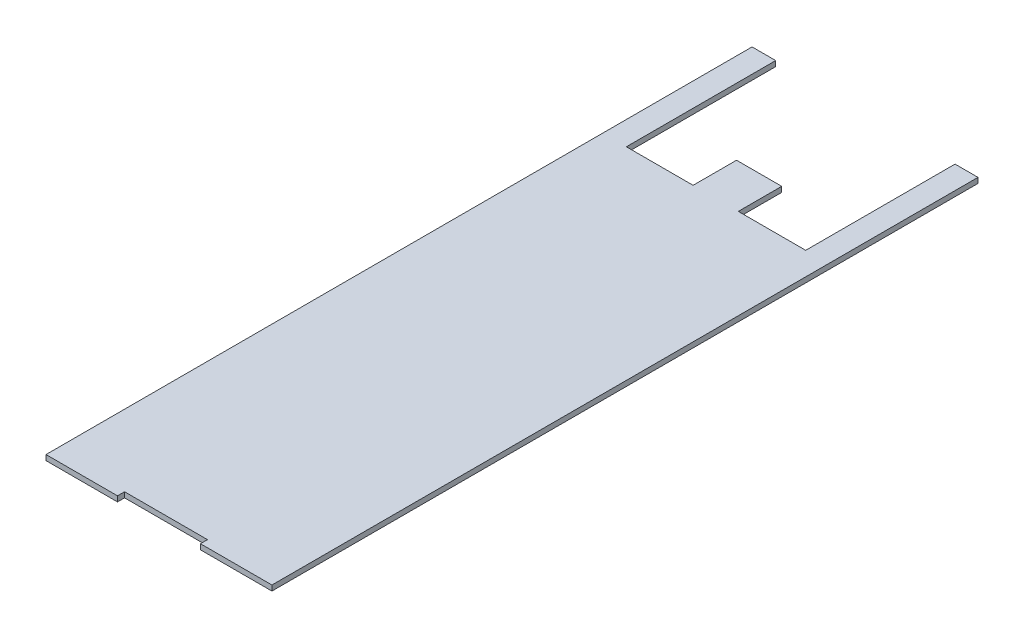
ISO-10303-21;
HEADER;
FILE_DESCRIPTION(('STEP AP214'),'2;1');
FILE_NAME('part.step','',(''),(''),'','','');
FILE_SCHEMA(('AUTOMOTIVE_DESIGN { 1 0 10303 214 1 1 1 1 }'));
ENDSEC;
DATA;
#1=APPLICATION_CONTEXT('core data for automotive mechanical design processes');
#2=APPLICATION_PROTOCOL_DEFINITION('international standard','automotive_design',2000,#1);
#3=PRODUCT_CONTEXT('',#1,'mechanical');
#4=PRODUCT('Part','Part','',(#3));
#5=PRODUCT_RELATED_PRODUCT_CATEGORY('part','',(#4));
#6=PRODUCT_DEFINITION_FORMATION('','',#4);
#7=PRODUCT_DEFINITION_CONTEXT('part definition',#1,'design');
#8=PRODUCT_DEFINITION('design','',#6,#7);
#9=PRODUCT_DEFINITION_SHAPE('','',#8);
#10=(LENGTH_UNIT() NAMED_UNIT(*) SI_UNIT(.MILLI.,.METRE.));
#11=(NAMED_UNIT(*) PLANE_ANGLE_UNIT() SI_UNIT($,.RADIAN.));
#12=(NAMED_UNIT(*) SI_UNIT($,.STERADIAN.) SOLID_ANGLE_UNIT());
#13=UNCERTAINTY_MEASURE_WITH_UNIT(LENGTH_MEASURE(1.E-05),#10,'distance_accuracy_value','');
#14=(GEOMETRIC_REPRESENTATION_CONTEXT(3) GLOBAL_UNCERTAINTY_ASSIGNED_CONTEXT((#13)) GLOBAL_UNIT_ASSIGNED_CONTEXT((#10,
#11,#12)) REPRESENTATION_CONTEXT('',''));
#15=CARTESIAN_POINT('',(0.,0.,0.));
#16=DIRECTION('',(0.,0.,1.));
#17=DIRECTION('',(1.,0.,0.));
#18=AXIS2_PLACEMENT_3D('',#15,#16,#17);
#19=CARTESIAN_POINT('',(-175.21084361372,-551.298939869281,789.620141884685));
#20=DIRECTION('',(0.,0.,-1.));
#21=DIRECTION('',(-1.,0.,0.));
#22=AXIS2_PLACEMENT_3D('',#19,#20,#21);
#23=PLANE('',#22);
#24=DIRECTION('',(-1.,0.,0.));
#25=VECTOR('',#24,1.);
#26=CARTESIAN_POINT('',(-175.21084361372,-548.298939869281,789.620141884685));
#27=LINE('',#26,#25);
#28=CARTESIAN_POINT('',(-47.2108436137029,-548.298939869281,789.620141884685));
#29=VERTEX_POINT('',#28);
#30=CARTESIAN_POINT('',(-87.7108436137114,-548.298939869281,789.620141884685));
#31=VERTEX_POINT('',#30);
#32=EDGE_CURVE('E195',#29,#31,#27,.T.);
#33=ORIENTED_EDGE('',*,*,#32,.T.);
#34=DIRECTION('',(0.,-1.,0.));
#35=VECTOR('',#34,1.);
#36=CARTESIAN_POINT('',(-87.7108436137114,-551.298939869281,789.620141884685));
#37=LINE('',#36,#35);
#38=CARTESIAN_POINT('',(-87.7108436137114,-551.298939869281,789.620141884685));
#39=VERTEX_POINT('',#38);
#40=EDGE_CURVE('E176',#31,#39,#37,.T.);
#41=ORIENTED_EDGE('',*,*,#40,.T.);
#42=DIRECTION('',(-1.,0.,0.));
#43=VECTOR('',#42,1.);
#44=CARTESIAN_POINT('',(-175.21084361372,-551.298939869281,789.620141884685));
#45=LINE('',#44,#43);
#46=CARTESIAN_POINT('',(-47.2108436137029,-551.298939869281,789.620141884685));
#47=VERTEX_POINT('',#46);
#48=EDGE_CURVE('E167',#47,#39,#45,.T.);
#49=ORIENTED_EDGE('',*,*,#48,.F.);
#50=DIRECTION('',(0.,1.,0.));
#51=VECTOR('',#50,1.);
#52=CARTESIAN_POINT('',(-47.2108436137029,-551.298939869281,789.620141884685));
#53=LINE('',#52,#51);
#54=EDGE_CURVE('E161',#47,#29,#53,.T.);
#55=ORIENTED_EDGE('',*,*,#54,.T.);
#56=EDGE_LOOP('',(#33,#41,#49,#55));
#57=FACE_BOUND('',#56,.T.);
#58=ADVANCED_FACE('F33',(#57),#23,.F.);
#59=CARTESIAN_POINT('',(-175.21084361372,-551.298939869281,789.620141884685));
#60=DIRECTION('',(1.,0.,0.));
#61=DIRECTION('',(0.,1.,0.));
#62=AXIS2_PLACEMENT_3D('',#59,#60,#61);
#63=PLANE('',#62);
#64=DIRECTION('',(0.,0.,-1.));
#65=VECTOR('',#64,1.);
#66=CARTESIAN_POINT('',(-175.21084361372,-548.298939869281,789.620141884685));
#67=LINE('',#66,#65);
#68=CARTESIAN_POINT('',(-175.21084361372,-548.298939869281,789.620141884685));
#69=VERTEX_POINT('',#68);
#70=CARTESIAN_POINT('',(-175.21084361372,-548.298939869281,389.620141884643));
#71=VERTEX_POINT('',#70);
#72=EDGE_CURVE('E172',#69,#71,#67,.T.);
#73=ORIENTED_EDGE('',*,*,#72,.T.);
#74=DIRECTION('',(0.,1.,0.));
#75=VECTOR('',#74,1.);
#76=CARTESIAN_POINT('',(-175.21084361372,-551.298939869281,389.620141884643));
#77=LINE('',#76,#75);
#78=CARTESIAN_POINT('',(-175.21084361372,-551.298939869281,389.620141884643));
#79=VERTEX_POINT('',#78);
#80=EDGE_CURVE('E41',#79,#71,#77,.T.);
#81=ORIENTED_EDGE('',*,*,#80,.F.);
#82=DIRECTION('',(0.,0.,-1.));
#83=VECTOR('',#82,1.);
#84=CARTESIAN_POINT('',(-175.21084361372,-551.298939869281,789.620141884685));
#85=LINE('',#84,#83);
#86=CARTESIAN_POINT('',(-175.21084361372,-551.298939869281,789.620141884685));
#87=VERTEX_POINT('',#86);
#88=EDGE_CURVE('E198',#87,#79,#85,.T.);
#89=ORIENTED_EDGE('',*,*,#88,.F.);
#90=DIRECTION('',(0.,1.,0.));
#91=VECTOR('',#90,1.);
#92=CARTESIAN_POINT('',(-175.21084361372,-551.298939869281,789.620141884685));
#93=LINE('',#92,#91);
#94=EDGE_CURVE('E171',#87,#69,#93,.T.);
#95=ORIENTED_EDGE('',*,*,#94,.T.);
#96=EDGE_LOOP('',(#73,#81,#89,#95));
#97=FACE_BOUND('',#96,.T.);
#98=ADVANCED_FACE('F35',(#97),#63,.F.);
#99=CARTESIAN_POINT('',(-175.21084361372,-551.298939869281,389.620141884643));
#100=DIRECTION('',(0.,0.,1.));
#101=DIRECTION('',(1.,0.,0.));
#102=AXIS2_PLACEMENT_3D('',#99,#100,#101);
#103=PLANE('',#102);
#104=DIRECTION('',(1.,0.,0.));
#105=VECTOR('',#104,1.);
#106=CARTESIAN_POINT('',(-175.21084361372,-548.298939869281,389.620141884643));
#107=LINE('',#106,#105);
#108=CARTESIAN_POINT('',(-161.8182411177,-548.298939869281,389.620141884643));
#109=VERTEX_POINT('',#108);
#110=EDGE_CURVE('E175',#71,#109,#107,.T.);
#111=ORIENTED_EDGE('',*,*,#110,.T.);
#112=DIRECTION('',(0.,1.,0.));
#113=VECTOR('',#112,1.);
#114=CARTESIAN_POINT('',(-161.8182411177,-551.298939869281,389.620141884643));
#115=LINE('',#114,#113);
#116=CARTESIAN_POINT('',(-161.8182411177,-551.298939869281,389.620141884643));
#117=VERTEX_POINT('',#116);
#118=EDGE_CURVE('E220',#117,#109,#115,.T.);
#119=ORIENTED_EDGE('',*,*,#118,.F.);
#120=DIRECTION('',(1.,0.,0.));
#121=VECTOR('',#120,1.);
#122=CARTESIAN_POINT('',(-175.21084361372,-551.298939869281,389.620141884643));
#123=LINE('',#122,#121);
#124=EDGE_CURVE('E112',#79,#117,#123,.T.);
#125=ORIENTED_EDGE('',*,*,#124,.F.);
#126=ORIENTED_EDGE('',*,*,#80,.T.);
#127=EDGE_LOOP('',(#111,#119,#125,#126));
#128=FACE_BOUND('',#127,.T.);
#129=ADVANCED_FACE('F223',(#128),#103,.F.);
#130=CARTESIAN_POINT('',(-161.8182411177,-551.298939869281,474.220141884642));
#131=DIRECTION('',(-1.,0.,0.));
#132=DIRECTION('',(0.,-1.,0.));
#133=AXIS2_PLACEMENT_3D('',#130,#131,#132);
#134=PLANE('',#133);
#135=DIRECTION('',(0.,0.,1.));
#136=VECTOR('',#135,1.);
#137=CARTESIAN_POINT('',(-161.8182411177,-548.298939869281,474.220141884642));
#138=LINE('',#137,#136);
#139=CARTESIAN_POINT('',(-161.8182411177,-548.298939869281,474.220141884642));
#140=VERTEX_POINT('',#139);
#141=EDGE_CURVE('E178',#109,#140,#138,.T.);
#142=ORIENTED_EDGE('',*,*,#141,.T.);
#143=DIRECTION('',(0.,1.,0.));
#144=VECTOR('',#143,1.);
#145=CARTESIAN_POINT('',(-161.8182411177,-551.298939869281,474.220141884642));
#146=LINE('',#145,#144);
#147=CARTESIAN_POINT('',(-161.8182411177,-551.298939869281,474.220141884642));
#148=VERTEX_POINT('',#147);
#149=EDGE_CURVE('E217',#148,#140,#146,.T.);
#150=ORIENTED_EDGE('',*,*,#149,.F.);
#151=DIRECTION('',(0.,0.,1.));
#152=VECTOR('',#151,1.);
#153=CARTESIAN_POINT('',(-161.8182411177,-551.298939869281,474.220141884642));
#154=LINE('',#153,#152);
#155=EDGE_CURVE('E246',#117,#148,#154,.T.);
#156=ORIENTED_EDGE('',*,*,#155,.F.);
#157=ORIENTED_EDGE('',*,*,#118,.T.);
#158=EDGE_LOOP('',(#142,#150,#156,#157));
#159=FACE_BOUND('',#158,.T.);
#160=ADVANCED_FACE('F237',(#159),#134,.F.);
#161=CARTESIAN_POINT('',(-161.8182411177,-551.298939869281,474.220141884642));
#162=DIRECTION('',(0.,0.,1.));
#163=DIRECTION('',(1.,0.,0.));
#164=AXIS2_PLACEMENT_3D('',#161,#162,#163);
#165=PLANE('',#164);
#166=DIRECTION('',(1.,0.,0.));
#167=VECTOR('',#166,1.);
#168=CARTESIAN_POINT('',(-161.8182411177,-548.298939869281,474.220141884642));
#169=LINE('',#168,#167);
#170=CARTESIAN_POINT('',(-124.010843613703,-548.298939869281,474.220141884642));
#171=VERTEX_POINT('',#170);
#172=EDGE_CURVE('E180',#140,#171,#169,.T.);
#173=ORIENTED_EDGE('',*,*,#172,.T.);
#174=DIRECTION('',(0.,1.,0.));
#175=VECTOR('',#174,1.);
#176=CARTESIAN_POINT('',(-124.010843613703,-551.298939869281,474.220141884642));
#177=LINE('',#176,#175);
#178=CARTESIAN_POINT('',(-124.010843613703,-551.298939869281,474.220141884642));
#179=VERTEX_POINT('',#178);
#180=EDGE_CURVE('E214',#179,#171,#177,.T.);
#181=ORIENTED_EDGE('',*,*,#180,.F.);
#182=DIRECTION('',(1.,0.,0.));
#183=VECTOR('',#182,1.);
#184=CARTESIAN_POINT('',(-161.8182411177,-551.298939869281,474.220141884642));
#185=LINE('',#184,#183);
#186=EDGE_CURVE('E243',#148,#179,#185,.T.);
#187=ORIENTED_EDGE('',*,*,#186,.F.);
#188=ORIENTED_EDGE('',*,*,#149,.T.);
#189=EDGE_LOOP('',(#173,#181,#187,#188));
#190=FACE_BOUND('',#189,.T.);
#191=ADVANCED_FACE('F241',(#190),#165,.F.);
#192=CARTESIAN_POINT('',(-124.010843613703,-551.298939869281,474.220141884642));
#193=DIRECTION('',(1.,0.,0.));
#194=DIRECTION('',(0.,1.,0.));
#195=AXIS2_PLACEMENT_3D('',#192,#193,#194);
#196=PLANE('',#195);
#197=DIRECTION('',(0.,0.,-1.));
#198=VECTOR('',#197,1.);
#199=CARTESIAN_POINT('',(-124.010843613703,-548.298939869281,474.220141884642));
#200=LINE('',#199,#198);
#201=CARTESIAN_POINT('',(-124.010843613703,-548.298939869281,449.620141884643));
#202=VERTEX_POINT('',#201);
#203=EDGE_CURVE('E182',#171,#202,#200,.T.);
#204=ORIENTED_EDGE('',*,*,#203,.T.);
#205=DIRECTION('',(0.,1.,0.));
#206=VECTOR('',#205,1.);
#207=CARTESIAN_POINT('',(-124.010843613703,-551.298939869281,449.620141884643));
#208=LINE('',#207,#206);
#209=CARTESIAN_POINT('',(-124.010843613703,-551.298939869281,449.620141884643));
#210=VERTEX_POINT('',#209);
#211=EDGE_CURVE('E211',#210,#202,#208,.T.);
#212=ORIENTED_EDGE('',*,*,#211,.F.);
#213=DIRECTION('',(0.,0.,-1.));
#214=VECTOR('',#213,1.);
#215=CARTESIAN_POINT('',(-124.010843613703,-551.298939869281,474.220141884642));
#216=LINE('',#215,#214);
#217=EDGE_CURVE('E245',#179,#210,#216,.T.);
#218=ORIENTED_EDGE('',*,*,#217,.F.);
#219=ORIENTED_EDGE('',*,*,#180,.T.);
#220=EDGE_LOOP('',(#204,#212,#218,#219));
#221=FACE_BOUND('',#220,.T.);
#222=ADVANCED_FACE('F348',(#221),#196,.F.);
#223=CARTESIAN_POINT('',(-124.010843613703,-551.298939869281,449.620141884643));
#224=DIRECTION('',(0.,0.,1.));
#225=DIRECTION('',(1.,0.,0.));
#226=AXIS2_PLACEMENT_3D('',#223,#224,#225);
#227=PLANE('',#226);
#228=DIRECTION('',(1.,0.,0.));
#229=VECTOR('',#228,1.);
#230=CARTESIAN_POINT('',(-124.010843613703,-548.298939869281,449.620141884643));
#231=LINE('',#230,#229);
#232=CARTESIAN_POINT('',(-98.4108436137032,-548.298939869281,449.620141884643));
#233=VERTEX_POINT('',#232);
#234=EDGE_CURVE('E184',#202,#233,#231,.T.);
#235=ORIENTED_EDGE('',*,*,#234,.T.);
#236=DIRECTION('',(0.,1.,0.));
#237=VECTOR('',#236,1.);
#238=CARTESIAN_POINT('',(-98.4108436137032,-551.298939869281,449.620141884643));
#239=LINE('',#238,#237);
#240=CARTESIAN_POINT('',(-98.4108436137032,-551.298939869281,449.620141884643));
#241=VERTEX_POINT('',#240);
#242=EDGE_CURVE('E208',#241,#233,#239,.T.);
#243=ORIENTED_EDGE('',*,*,#242,.F.);
#244=DIRECTION('',(1.,0.,0.));
#245=VECTOR('',#244,1.);
#246=CARTESIAN_POINT('',(-124.010843613703,-551.298939869281,449.620141884643));
#247=LINE('',#246,#245);
#248=EDGE_CURVE('E248',#210,#241,#247,.T.);
#249=ORIENTED_EDGE('',*,*,#248,.F.);
#250=ORIENTED_EDGE('',*,*,#211,.T.);
#251=EDGE_LOOP('',(#235,#243,#249,#250));
#252=FACE_BOUND('',#251,.T.);
#253=ADVANCED_FACE('F344',(#252),#227,.F.);
#254=CARTESIAN_POINT('',(-98.4108436137032,-551.298939869281,474.220141884642));
#255=DIRECTION('',(-1.,0.,0.));
#256=DIRECTION('',(0.,-1.,0.));
#257=AXIS2_PLACEMENT_3D('',#254,#255,#256);
#258=PLANE('',#257);
#259=DIRECTION('',(0.,0.,1.));
#260=VECTOR('',#259,1.);
#261=CARTESIAN_POINT('',(-98.4108436137032,-548.298939869281,474.220141884642));
#262=LINE('',#261,#260);
#263=CARTESIAN_POINT('',(-98.4108436137032,-548.298939869281,474.220141884642));
#264=VERTEX_POINT('',#263);
#265=EDGE_CURVE('E186',#233,#264,#262,.T.);
#266=ORIENTED_EDGE('',*,*,#265,.T.);
#267=DIRECTION('',(0.,1.,0.));
#268=VECTOR('',#267,1.);
#269=CARTESIAN_POINT('',(-98.4108436137032,-551.298939869281,474.220141884642));
#270=LINE('',#269,#268);
#271=CARTESIAN_POINT('',(-98.4108436137032,-551.298939869281,474.220141884642));
#272=VERTEX_POINT('',#271);
#273=EDGE_CURVE('E205',#272,#264,#270,.T.);
#274=ORIENTED_EDGE('',*,*,#273,.F.);
#275=DIRECTION('',(0.,0.,1.));
#276=VECTOR('',#275,1.);
#277=CARTESIAN_POINT('',(-98.4108436137032,-551.298939869281,474.220141884642));
#278=LINE('',#277,#276);
#279=EDGE_CURVE('E254',#241,#272,#278,.T.);
#280=ORIENTED_EDGE('',*,*,#279,.F.);
#281=ORIENTED_EDGE('',*,*,#242,.T.);
#282=EDGE_LOOP('',(#266,#274,#280,#281));
#283=FACE_BOUND('',#282,.T.);
#284=ADVANCED_FACE('F341',(#283),#258,.F.);
#285=CARTESIAN_POINT('',(-98.4108436137032,-551.298939869281,474.220141884642));
#286=DIRECTION('',(0.,0.,1.));
#287=DIRECTION('',(1.,0.,0.));
#288=AXIS2_PLACEMENT_3D('',#285,#286,#287);
#289=PLANE('',#288);
#290=DIRECTION('',(1.,0.,0.));
#291=VECTOR('',#290,1.);
#292=CARTESIAN_POINT('',(-98.4108436137032,-548.298939869281,474.220141884642));
#293=LINE('',#292,#291);
#294=CARTESIAN_POINT('',(-60.2182411176998,-548.298939869281,474.220141884642));
#295=VERTEX_POINT('',#294);
#296=EDGE_CURVE('E188',#264,#295,#293,.T.);
#297=ORIENTED_EDGE('',*,*,#296,.T.);
#298=DIRECTION('',(0.,1.,0.));
#299=VECTOR('',#298,1.);
#300=CARTESIAN_POINT('',(-60.2182411176998,-551.298939869281,474.220141884642));
#301=LINE('',#300,#299);
#302=CARTESIAN_POINT('',(-60.2182411176998,-551.298939869281,474.220141884642));
#303=VERTEX_POINT('',#302);
#304=EDGE_CURVE('E202',#303,#295,#301,.T.);
#305=ORIENTED_EDGE('',*,*,#304,.F.);
#306=DIRECTION('',(1.,0.,0.));
#307=VECTOR('',#306,1.);
#308=CARTESIAN_POINT('',(-98.4108436137032,-551.298939869281,474.220141884642));
#309=LINE('',#308,#307);
#310=EDGE_CURVE('E256',#272,#303,#309,.T.);
#311=ORIENTED_EDGE('',*,*,#310,.F.);
#312=ORIENTED_EDGE('',*,*,#273,.T.);
#313=EDGE_LOOP('',(#297,#305,#311,#312));
#314=FACE_BOUND('',#313,.T.);
#315=ADVANCED_FACE('F262',(#314),#289,.F.);
#316=CARTESIAN_POINT('',(-60.2182411176998,-551.298939869281,474.220141884642));
#317=DIRECTION('',(1.,0.,0.));
#318=DIRECTION('',(0.,1.,0.));
#319=AXIS2_PLACEMENT_3D('',#316,#317,#318);
#320=PLANE('',#319);
#321=DIRECTION('',(0.,0.,-1.));
#322=VECTOR('',#321,1.);
#323=CARTESIAN_POINT('',(-60.2182411176998,-548.298939869281,474.220141884642));
#324=LINE('',#323,#322);
#325=CARTESIAN_POINT('',(-60.2182411176998,-548.298939869281,389.620141884643));
#326=VERTEX_POINT('',#325);
#327=EDGE_CURVE('E190',#295,#326,#324,.T.);
#328=ORIENTED_EDGE('',*,*,#327,.T.);
#329=DIRECTION('',(0.,1.,0.));
#330=VECTOR('',#329,1.);
#331=CARTESIAN_POINT('',(-60.2182411176998,-551.298939869281,389.620141884643));
#332=LINE('',#331,#330);
#333=CARTESIAN_POINT('',(-60.2182411176998,-551.298939869281,389.620141884643));
#334=VERTEX_POINT('',#333);
#335=EDGE_CURVE('E160',#334,#326,#332,.T.);
#336=ORIENTED_EDGE('',*,*,#335,.F.);
#337=DIRECTION('',(0.,0.,-1.));
#338=VECTOR('',#337,1.);
#339=CARTESIAN_POINT('',(-60.2182411176998,-551.298939869281,474.220141884642));
#340=LINE('',#339,#338);
#341=EDGE_CURVE('E148',#303,#334,#340,.T.);
#342=ORIENTED_EDGE('',*,*,#341,.F.);
#343=ORIENTED_EDGE('',*,*,#304,.T.);
#344=EDGE_LOOP('',(#328,#336,#342,#343));
#345=FACE_BOUND('',#344,.T.);
#346=ADVANCED_FACE('F266',(#345),#320,.F.);
#347=CARTESIAN_POINT('',(-60.2182411176998,-551.298939869281,389.620141884643));
#348=DIRECTION('',(0.,0.,1.));
#349=DIRECTION('',(1.,0.,0.));
#350=AXIS2_PLACEMENT_3D('',#347,#348,#349);
#351=PLANE('',#350);
#352=DIRECTION('',(1.,0.,0.));
#353=VECTOR('',#352,1.);
#354=CARTESIAN_POINT('',(-60.2182411176998,-548.298939869281,389.620141884643));
#355=LINE('',#354,#353);
#356=CARTESIAN_POINT('',(-47.2108436137029,-548.298939869281,389.620141884643));
#357=VERTEX_POINT('',#356);
#358=EDGE_CURVE('E157',#326,#357,#355,.T.);
#359=ORIENTED_EDGE('',*,*,#358,.T.);
#360=DIRECTION('',(0.,1.,0.));
#361=VECTOR('',#360,1.);
#362=CARTESIAN_POINT('',(-47.2108436137029,-551.298939869281,389.620141884643));
#363=LINE('',#362,#361);
#364=CARTESIAN_POINT('',(-47.2108436137029,-551.298939869281,389.620141884643));
#365=VERTEX_POINT('',#364);
#366=EDGE_CURVE('E154',#365,#357,#363,.T.);
#367=ORIENTED_EDGE('',*,*,#366,.F.);
#368=DIRECTION('',(1.,0.,0.));
#369=VECTOR('',#368,1.);
#370=CARTESIAN_POINT('',(-60.2182411176998,-551.298939869281,389.620141884643));
#371=LINE('',#370,#369);
#372=EDGE_CURVE('E139',#334,#365,#371,.T.);
#373=ORIENTED_EDGE('',*,*,#372,.F.);
#374=ORIENTED_EDGE('',*,*,#335,.T.);
#375=EDGE_LOOP('',(#359,#367,#373,#374));
#376=FACE_BOUND('',#375,.T.);
#377=ADVANCED_FACE('F155',(#376),#351,.F.);
#378=CARTESIAN_POINT('',(-47.2108436137029,-551.298939869281,789.620141884685));
#379=DIRECTION('',(-1.,0.,0.));
#380=DIRECTION('',(0.,-1.,0.));
#381=AXIS2_PLACEMENT_3D('',#378,#379,#380);
#382=PLANE('',#381);
#383=DIRECTION('',(0.,0.,1.));
#384=VECTOR('',#383,1.);
#385=CARTESIAN_POINT('',(-47.2108436137029,-548.298939869281,789.620141884685));
#386=LINE('',#385,#384);
#387=EDGE_CURVE('E193',#357,#29,#386,.T.);
#388=ORIENTED_EDGE('',*,*,#387,.T.);
#389=ORIENTED_EDGE('',*,*,#54,.F.);
#390=DIRECTION('',(0.,0.,1.));
#391=VECTOR('',#390,1.);
#392=CARTESIAN_POINT('',(-47.2108436137029,-551.298939869281,789.620141884685));
#393=LINE('',#392,#391);
#394=EDGE_CURVE('E145',#365,#47,#393,.T.);
#395=ORIENTED_EDGE('',*,*,#394,.F.);
#396=ORIENTED_EDGE('',*,*,#366,.T.);
#397=EDGE_LOOP('',(#388,#389,#395,#396));
#398=FACE_BOUND('',#397,.T.);
#399=ADVANCED_FACE('F163',(#398),#382,.F.);
#400=CARTESIAN_POINT('',(-134.710843613711,-551.298939869281,789.620141884685));
#401=VERTEX_POINT('',#400);
#402=EDGE_CURVE('E57',#401,#87,#45,.T.);
#403=ORIENTED_EDGE('',*,*,#402,.F.);
#404=DIRECTION('',(0.,1.,0.));
#405=VECTOR('',#404,1.);
#406=CARTESIAN_POINT('',(-134.710843613711,-551.298939869281,789.620141884685));
#407=LINE('',#406,#405);
#408=CARTESIAN_POINT('',(-134.710843613711,-548.298939869281,789.620141884685));
#409=VERTEX_POINT('',#408);
#410=EDGE_CURVE('E305',#401,#409,#407,.T.);
#411=ORIENTED_EDGE('',*,*,#410,.T.);
#412=EDGE_CURVE('E103',#409,#69,#27,.T.);
#413=ORIENTED_EDGE('',*,*,#412,.T.);
#414=ORIENTED_EDGE('',*,*,#94,.F.);
#415=EDGE_LOOP('',(#403,#411,#413,#414));
#416=FACE_BOUND('',#415,.T.);
#417=ADVANCED_FACE('F309',(#416),#23,.F.);
#418=CARTESIAN_POINT('',(0.,-551.298939869281,0.));
#419=DIRECTION('',(0.,-1.,0.));
#420=DIRECTION('',(0.,0.,-1.));
#421=AXIS2_PLACEMENT_3D('',#418,#419,#420);
#422=PLANE('',#421);
#423=DIRECTION('',(0.,0.,1.));
#424=VECTOR('',#423,1.);
#425=CARTESIAN_POINT('',(-87.7108436137114,-551.298939869281,0.));
#426=LINE('',#425,#424);
#427=CARTESIAN_POINT('',(-87.7108436137114,-551.298939869281,785.620141884685));
#428=VERTEX_POINT('',#427);
#429=EDGE_CURVE('E275',#428,#39,#426,.T.);
#430=ORIENTED_EDGE('',*,*,#429,.F.);
#431=DIRECTION('',(1.,0.,0.));
#432=VECTOR('',#431,1.);
#433=CARTESIAN_POINT('',(0.,-551.298939869281,785.620141884685));
#434=LINE('',#433,#432);
#435=CARTESIAN_POINT('',(-134.710843613711,-551.298939869281,785.620141884685));
#436=VERTEX_POINT('',#435);
#437=EDGE_CURVE('E295',#436,#428,#434,.T.);
#438=ORIENTED_EDGE('',*,*,#437,.F.);
#439=DIRECTION('',(0.,0.,-1.));
#440=VECTOR('',#439,1.);
#441=CARTESIAN_POINT('',(-134.710843613711,-551.298939869281,0.));
#442=LINE('',#441,#440);
#443=EDGE_CURVE('E294',#401,#436,#442,.T.);
#444=ORIENTED_EDGE('',*,*,#443,.F.);
#445=ORIENTED_EDGE('',*,*,#402,.T.);
#446=ORIENTED_EDGE('',*,*,#88,.T.);
#447=ORIENTED_EDGE('',*,*,#124,.T.);
#448=ORIENTED_EDGE('',*,*,#155,.T.);
#449=ORIENTED_EDGE('',*,*,#186,.T.);
#450=ORIENTED_EDGE('',*,*,#217,.T.);
#451=ORIENTED_EDGE('',*,*,#248,.T.);
#452=ORIENTED_EDGE('',*,*,#279,.T.);
#453=ORIENTED_EDGE('',*,*,#310,.T.);
#454=ORIENTED_EDGE('',*,*,#341,.T.);
#455=ORIENTED_EDGE('',*,*,#372,.T.);
#456=ORIENTED_EDGE('',*,*,#394,.T.);
#457=ORIENTED_EDGE('',*,*,#48,.T.);
#458=EDGE_LOOP('',(#430,#438,#444,#445,#446,#447,#448,#449,#450,#451,#452,#453,#454,#455,#456,#457));
#459=FACE_BOUND('',#458,.T.);
#460=ADVANCED_FACE('F142',(#459),#422,.T.);
#461=CARTESIAN_POINT('',(0.,-548.298939869281,0.));
#462=DIRECTION('',(0.,-1.,0.));
#463=DIRECTION('',(0.,0.,-1.));
#464=AXIS2_PLACEMENT_3D('',#461,#462,#463);
#465=PLANE('',#464);
#466=DIRECTION('',(-1.,0.,0.));
#467=VECTOR('',#466,1.);
#468=CARTESIAN_POINT('',(-134.710843613711,-548.298939869281,785.620141884685));
#469=LINE('',#468,#467);
#470=CARTESIAN_POINT('',(-87.7108436137114,-548.298939869281,785.620141884685));
#471=VERTEX_POINT('',#470);
#472=CARTESIAN_POINT('',(-134.710843613711,-548.298939869281,785.620141884685));
#473=VERTEX_POINT('',#472);
#474=EDGE_CURVE('E297',#471,#473,#469,.T.);
#475=ORIENTED_EDGE('',*,*,#474,.F.);
#476=DIRECTION('',(0.,0.,1.));
#477=VECTOR('',#476,1.);
#478=CARTESIAN_POINT('',(-87.7108436137114,-548.298939869281,0.));
#479=LINE('',#478,#477);
#480=EDGE_CURVE('E11',#471,#31,#479,.T.);
#481=ORIENTED_EDGE('',*,*,#480,.T.);
#482=ORIENTED_EDGE('',*,*,#32,.F.);
#483=ORIENTED_EDGE('',*,*,#387,.F.);
#484=ORIENTED_EDGE('',*,*,#358,.F.);
#485=ORIENTED_EDGE('',*,*,#327,.F.);
#486=ORIENTED_EDGE('',*,*,#296,.F.);
#487=ORIENTED_EDGE('',*,*,#265,.F.);
#488=ORIENTED_EDGE('',*,*,#234,.F.);
#489=ORIENTED_EDGE('',*,*,#203,.F.);
#490=ORIENTED_EDGE('',*,*,#172,.F.);
#491=ORIENTED_EDGE('',*,*,#141,.F.);
#492=ORIENTED_EDGE('',*,*,#110,.F.);
#493=ORIENTED_EDGE('',*,*,#72,.F.);
#494=ORIENTED_EDGE('',*,*,#412,.F.);
#495=DIRECTION('',(0.,0.,1.));
#496=VECTOR('',#495,1.);
#497=CARTESIAN_POINT('',(-134.710843613711,-548.298939869281,793.620141884685));
#498=LINE('',#497,#496);
#499=EDGE_CURVE('E293',#473,#409,#498,.T.);
#500=ORIENTED_EDGE('',*,*,#499,.F.);
#501=EDGE_LOOP('',(#475,#481,#482,#483,#484,#485,#486,#487,#488,#489,#490,#491,#492,#493,#494,#500));
#502=FACE_BOUND('',#501,.T.);
#503=ADVANCED_FACE('F229',(#502),#465,.F.);
#504=CARTESIAN_POINT('',(-87.7108436137114,-558.298939869281,793.620141884685));
#505=DIRECTION('',(1.,0.,0.));
#506=DIRECTION('',(0.,0.,-1.));
#507=AXIS2_PLACEMENT_3D('',#504,#505,#506);
#508=PLANE('',#507);
#509=ORIENTED_EDGE('',*,*,#480,.F.);
#510=DIRECTION('',(0.,1.,0.));
#511=VECTOR('',#510,1.);
#512=CARTESIAN_POINT('',(-87.7108436137114,-558.298939869281,785.620141884685));
#513=LINE('',#512,#511);
#514=EDGE_CURVE('E48',#428,#471,#513,.T.);
#515=ORIENTED_EDGE('',*,*,#514,.F.);
#516=ORIENTED_EDGE('',*,*,#429,.T.);
#517=ORIENTED_EDGE('',*,*,#40,.F.);
#518=EDGE_LOOP('',(#509,#515,#516,#517));
#519=FACE_BOUND('',#518,.T.);
#520=ADVANCED_FACE('F310',(#519),#508,.F.);
#521=CARTESIAN_POINT('',(-134.710843613711,-558.298939869281,793.620141884685));
#522=DIRECTION('',(-1.,0.,0.));
#523=DIRECTION('',(0.,0.,1.));
#524=AXIS2_PLACEMENT_3D('',#521,#522,#523);
#525=PLANE('',#524);
#526=ORIENTED_EDGE('',*,*,#443,.T.);
#527=DIRECTION('',(0.,1.,0.));
#528=VECTOR('',#527,1.);
#529=CARTESIAN_POINT('',(-134.710843613711,-558.298939869281,785.620141884685));
#530=LINE('',#529,#528);
#531=EDGE_CURVE('E291',#436,#473,#530,.T.);
#532=ORIENTED_EDGE('',*,*,#531,.T.);
#533=ORIENTED_EDGE('',*,*,#499,.T.);
#534=ORIENTED_EDGE('',*,*,#410,.F.);
#535=EDGE_LOOP('',(#526,#532,#533,#534));
#536=FACE_BOUND('',#535,.T.);
#537=ADVANCED_FACE('F292',(#536),#525,.F.);
#538=CARTESIAN_POINT('',(-134.710843613711,-558.298939869281,785.620141884685));
#539=DIRECTION('',(0.,0.,-1.));
#540=DIRECTION('',(-1.,0.,0.));
#541=AXIS2_PLACEMENT_3D('',#538,#539,#540);
#542=PLANE('',#541);
#543=ORIENTED_EDGE('',*,*,#437,.T.);
#544=ORIENTED_EDGE('',*,*,#514,.T.);
#545=ORIENTED_EDGE('',*,*,#474,.T.);
#546=ORIENTED_EDGE('',*,*,#531,.F.);
#547=EDGE_LOOP('',(#543,#544,#545,#546));
#548=FACE_BOUND('',#547,.T.);
#549=ADVANCED_FACE('F298',(#548),#542,.F.);
#550=CLOSED_SHELL('',(#58,#98,#129,#160,#191,#222,#253,#284,#315,#346,#377,#399,#417,#460,#503,
#520,#537,#549));
#551=MANIFOLD_SOLID_BREP('B2',#550);
#552=ADVANCED_BREP_SHAPE_REPRESENTATION('',(#18,#551),#14);
#553=SHAPE_DEFINITION_REPRESENTATION(#9,#552);
ENDSEC;
END-ISO-10303-21;
